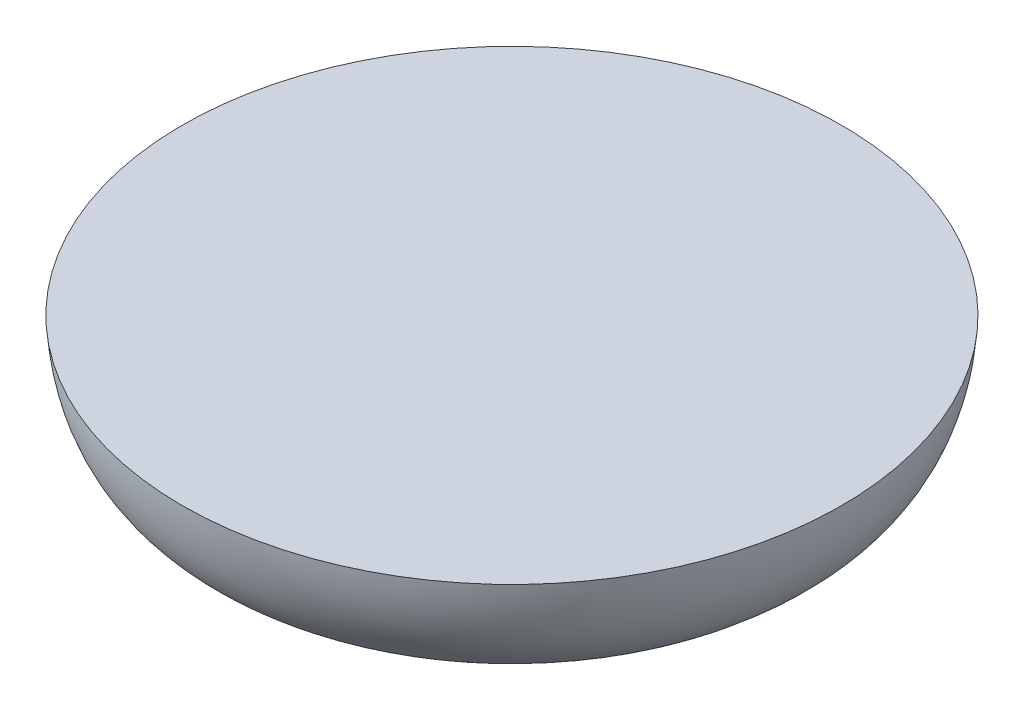
ISO-10303-21;
HEADER;
FILE_DESCRIPTION(('STEP AP214'),'2;1');
FILE_NAME('part.step','',(''),(''),'','','');
FILE_SCHEMA(('AUTOMOTIVE_DESIGN { 1 0 10303 214 1 1 1 1 }'));
ENDSEC;
DATA;
#1=APPLICATION_CONTEXT('core data for automotive mechanical design processes');
#2=APPLICATION_PROTOCOL_DEFINITION('international standard','automotive_design',2000,#1);
#3=PRODUCT_CONTEXT('',#1,'mechanical');
#4=PRODUCT('Part','Part','',(#3));
#5=PRODUCT_RELATED_PRODUCT_CATEGORY('part','',(#4));
#6=PRODUCT_DEFINITION_FORMATION('','',#4);
#7=PRODUCT_DEFINITION_CONTEXT('part definition',#1,'design');
#8=PRODUCT_DEFINITION('design','',#6,#7);
#9=PRODUCT_DEFINITION_SHAPE('','',#8);
#10=(LENGTH_UNIT() NAMED_UNIT(*) SI_UNIT(.MILLI.,.METRE.));
#11=(NAMED_UNIT(*) PLANE_ANGLE_UNIT() SI_UNIT($,.RADIAN.));
#12=(NAMED_UNIT(*) SI_UNIT($,.STERADIAN.) SOLID_ANGLE_UNIT());
#13=UNCERTAINTY_MEASURE_WITH_UNIT(LENGTH_MEASURE(1.E-05),#10,'distance_accuracy_value','');
#14=(GEOMETRIC_REPRESENTATION_CONTEXT(3) GLOBAL_UNCERTAINTY_ASSIGNED_CONTEXT((#13)) GLOBAL_UNIT_ASSIGNED_CONTEXT((#10,
#11,#12)) REPRESENTATION_CONTEXT('',''));
#15=CARTESIAN_POINT('',(0.,0.,0.));
#16=DIRECTION('',(0.,0.,1.));
#17=DIRECTION('',(1.,0.,0.));
#18=AXIS2_PLACEMENT_3D('',#15,#16,#17);
#19=CARTESIAN_POINT('',(-25.305,5.42639857806138,-1.7565804588227E-08));
#20=CARTESIAN_POINT('',(-24.5733528429578,-4.57155097053536,-1.7565804588227E-08));
#21=CARTESIAN_POINT('',(-14.1660649750657,-4.35960142193862,-1.7565804588227E-08));
#22=B_SPLINE_CURVE_WITH_KNOTS('',2,(#19,#20,#21),.UNSPECIFIED.,.F.,.F.,(3,3),(0.,1.),.UNSPECIFIED.);
#23=CARTESIAN_POINT('',(0.,25.7074331659991,-1.7565804588227E-08));
#24=DIRECTION('',(0.,1.,0.));
#25=AXIS1_PLACEMENT('',#23,#24);
#26=SURFACE_OF_REVOLUTION('',#22,#25);
#27=CARTESIAN_POINT('',(0.,-4.35960142193862,-1.7565804588227E-08));
#28=DIRECTION('',(0.,1.,0.));
#29=DIRECTION('',(0.,0.,1.));
#30=AXIS2_PLACEMENT_3D('',#27,#28,#29);
#31=CIRCLE('',#30,14.1660649750657);
#32=CARTESIAN_POINT('',(0.,-4.35960142193862,14.1660649574999));
#33=VERTEX_POINT('',#32);
#34=EDGE_CURVE('E52',#33,#33,#31,.T.);
#35=ORIENTED_EDGE('',*,*,#34,.T.);
#36=EDGE_LOOP('',(#35));
#37=FACE_BOUND('',#36,.T.);
#38=CARTESIAN_POINT('',(0.,5.42639857806138,-1.7565804588227E-08));
#39=DIRECTION('',(0.,1.,0.));
#40=DIRECTION('',(0.,0.,1.));
#41=AXIS2_PLACEMENT_3D('',#38,#39,#40);
#42=CIRCLE('',#41,25.305);
#43=CARTESIAN_POINT('',(0.,5.42639857806138,25.3049999824342));
#44=VERTEX_POINT('',#43);
#45=EDGE_CURVE('E10',#44,#44,#42,.T.);
#46=ORIENTED_EDGE('',*,*,#45,.F.);
#47=EDGE_LOOP('',(#46));
#48=FACE_BOUND('',#47,.T.);
#49=ADVANCED_FACE('F37',(#37,#48),#26,.F.);
#50=CARTESIAN_POINT('',(-25.305,5.42639857806138,-1.7565804588227E-08));
#51=DIRECTION('',(0.,1.,0.));
#52=DIRECTION('',(0.,0.,1.));
#53=AXIS2_PLACEMENT_3D('',#50,#51,#52);
#54=PLANE('',#53);
#55=ORIENTED_EDGE('',*,*,#45,.T.);
#56=EDGE_LOOP('',(#55));
#57=FACE_BOUND('',#56,.T.);
#58=ADVANCED_FACE('F77',(#57),#54,.T.);
#59=CARTESIAN_POINT('',(0.,-6.12360142193862,-1.7565804588227E-08));
#60=DIRECTION('',(0.,-1.,0.));
#61=DIRECTION('',(0.,0.,-1.));
#62=AXIS2_PLACEMENT_3D('',#59,#60,#61);
#63=PLANE('',#62);
#64=CARTESIAN_POINT('',(0.,-6.12360142193861,-1.7565804588227E-08));
#65=DIRECTION('',(0.,1.,0.));
#66=DIRECTION('',(0.,0.,1.));
#67=AXIS2_PLACEMENT_3D('',#64,#65,#66);
#68=CIRCLE('',#67,8.925);
#69=CARTESIAN_POINT('',(0.,-6.12360142193861,8.92499998243419));
#70=VERTEX_POINT('',#69);
#71=EDGE_CURVE('E44',#70,#70,#68,.T.);
#72=ORIENTED_EDGE('',*,*,#71,.F.);
#73=EDGE_LOOP('',(#72));
#74=FACE_BOUND('',#73,.T.);
#75=ADVANCED_FACE('F74',(#74),#63,.T.);
#76=CARTESIAN_POINT('',(0.,25.7074331659991,-1.7565804588227E-08));
#77=DIRECTION('',(0.,1.,0.));
#78=DIRECTION('',(0.,0.,1.));
#79=AXIS2_PLACEMENT_3D('',#76,#77,#78);
#80=CYLINDRICAL_SURFACE('',#79,8.925);
#81=ORIENTED_EDGE('',*,*,#71,.T.);
#82=EDGE_LOOP('',(#81));
#83=FACE_BOUND('',#82,.T.);
#84=CARTESIAN_POINT('',(0.,-4.35960142193862,-1.7565804588227E-08));
#85=DIRECTION('',(0.,1.,0.));
#86=DIRECTION('',(0.,0.,1.));
#87=AXIS2_PLACEMENT_3D('',#84,#85,#86);
#88=CIRCLE('',#87,8.925);
#89=CARTESIAN_POINT('',(0.,-4.35960142193862,8.92499998243419));
#90=VERTEX_POINT('',#89);
#91=EDGE_CURVE('E48',#90,#90,#88,.T.);
#92=ORIENTED_EDGE('',*,*,#91,.F.);
#93=EDGE_LOOP('',(#92));
#94=FACE_BOUND('',#93,.T.);
#95=ADVANCED_FACE('F68',(#83,#94),#80,.T.);
#96=CARTESIAN_POINT('',(-8.925,-4.35960142193862,-1.7565804588227E-08));
#97=DIRECTION('',(0.,-1.,0.));
#98=DIRECTION('',(0.,0.,-1.));
#99=AXIS2_PLACEMENT_3D('',#96,#97,#98);
#100=PLANE('',#99);
#101=ORIENTED_EDGE('',*,*,#91,.T.);
#102=EDGE_LOOP('',(#101));
#103=FACE_BOUND('',#102,.T.);
#104=ORIENTED_EDGE('',*,*,#34,.F.);
#105=EDGE_LOOP('',(#104));
#106=FACE_BOUND('',#105,.T.);
#107=ADVANCED_FACE('F66',(#103,#106),#100,.T.);
#108=CLOSED_SHELL('',(#49,#58,#75,#95,#107));
#109=MANIFOLD_SOLID_BREP('B2',#108);
#110=ADVANCED_BREP_SHAPE_REPRESENTATION('',(#18,#109),#14);
#111=SHAPE_DEFINITION_REPRESENTATION(#9,#110);
ENDSEC;
END-ISO-10303-21;
